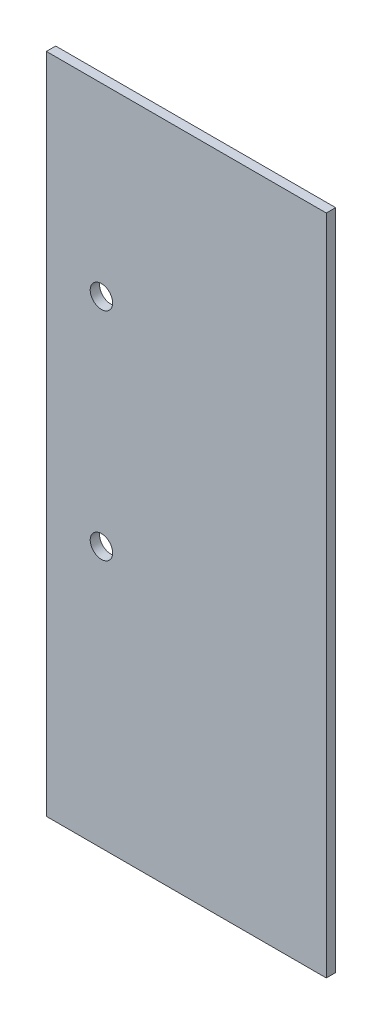
ISO-10303-21;
HEADER;
FILE_DESCRIPTION(('STEP AP214'),'2;1');
FILE_NAME('part.step','',(''),(''),'','','');
FILE_SCHEMA(('AUTOMOTIVE_DESIGN { 1 0 10303 214 1 1 1 1 }'));
ENDSEC;
DATA;
#1=APPLICATION_CONTEXT('core data for automotive mechanical design processes');
#2=APPLICATION_PROTOCOL_DEFINITION('international standard','automotive_design',2000,#1);
#3=PRODUCT_CONTEXT('',#1,'mechanical');
#4=PRODUCT('Part','Part','',(#3));
#5=PRODUCT_RELATED_PRODUCT_CATEGORY('part','',(#4));
#6=PRODUCT_DEFINITION_FORMATION('','',#4);
#7=PRODUCT_DEFINITION_CONTEXT('part definition',#1,'design');
#8=PRODUCT_DEFINITION('design','',#6,#7);
#9=PRODUCT_DEFINITION_SHAPE('','',#8);
#10=(LENGTH_UNIT() NAMED_UNIT(*) SI_UNIT(.MILLI.,.METRE.));
#11=(NAMED_UNIT(*) PLANE_ANGLE_UNIT() SI_UNIT($,.RADIAN.));
#12=(NAMED_UNIT(*) SI_UNIT($,.STERADIAN.) SOLID_ANGLE_UNIT());
#13=UNCERTAINTY_MEASURE_WITH_UNIT(LENGTH_MEASURE(1.E-05),#10,'distance_accuracy_value','');
#14=(GEOMETRIC_REPRESENTATION_CONTEXT(3) GLOBAL_UNCERTAINTY_ASSIGNED_CONTEXT((#13)) GLOBAL_UNIT_ASSIGNED_CONTEXT((#10,
#11,#12)) REPRESENTATION_CONTEXT('',''));
#15=CARTESIAN_POINT('',(0.,0.,0.));
#16=DIRECTION('',(0.,0.,1.));
#17=DIRECTION('',(1.,0.,0.));
#18=AXIS2_PLACEMENT_3D('',#15,#16,#17);
#19=CARTESIAN_POINT('',(75.,177.5,5.));
#20=DIRECTION('',(-1.,0.,0.));
#21=DIRECTION('',(0.,-1.,0.));
#22=AXIS2_PLACEMENT_3D('',#19,#20,#21);
#23=PLANE('',#22);
#24=DIRECTION('',(0.,1.,0.));
#25=VECTOR('',#24,1.);
#26=CARTESIAN_POINT('',(75.,177.5,0.));
#27=LINE('',#26,#25);
#28=CARTESIAN_POINT('',(75.0000000000001,-177.5,0.));
#29=VERTEX_POINT('',#28);
#30=CARTESIAN_POINT('',(75.,177.5,0.));
#31=VERTEX_POINT('',#30);
#32=EDGE_CURVE('E107',#29,#31,#27,.T.);
#33=ORIENTED_EDGE('',*,*,#32,.T.);
#34=DIRECTION('',(0.,0.,-1.));
#35=VECTOR('',#34,1.);
#36=CARTESIAN_POINT('',(75.,177.5,5.));
#37=LINE('',#36,#35);
#38=CARTESIAN_POINT('',(75.,177.5,5.));
#39=VERTEX_POINT('',#38);
#40=EDGE_CURVE('E11',#39,#31,#37,.T.);
#41=ORIENTED_EDGE('',*,*,#40,.F.);
#42=DIRECTION('',(0.,1.,0.));
#43=VECTOR('',#42,1.);
#44=CARTESIAN_POINT('',(75.,177.5,5.));
#45=LINE('',#44,#43);
#46=CARTESIAN_POINT('',(75.0000000000001,-177.5,5.));
#47=VERTEX_POINT('',#46);
#48=EDGE_CURVE('E94',#47,#39,#45,.T.);
#49=ORIENTED_EDGE('',*,*,#48,.F.);
#50=DIRECTION('',(0.,0.,-1.));
#51=VECTOR('',#50,1.);
#52=CARTESIAN_POINT('',(75.0000000000001,-177.5,5.));
#53=LINE('',#52,#51);
#54=EDGE_CURVE('E103',#47,#29,#53,.T.);
#55=ORIENTED_EDGE('',*,*,#54,.T.);
#56=EDGE_LOOP('',(#33,#41,#49,#55));
#57=FACE_BOUND('',#56,.T.);
#58=ADVANCED_FACE('F41',(#57),#23,.F.);
#59=CARTESIAN_POINT('',(-75.,177.5,5.));
#60=DIRECTION('',(0.,-1.,0.));
#61=DIRECTION('',(0.,0.,-1.));
#62=AXIS2_PLACEMENT_3D('',#59,#60,#61);
#63=PLANE('',#62);
#64=DIRECTION('',(-1.,0.,0.));
#65=VECTOR('',#64,1.);
#66=CARTESIAN_POINT('',(-75.,177.5,0.));
#67=LINE('',#66,#65);
#68=CARTESIAN_POINT('',(-75.,177.5,0.));
#69=VERTEX_POINT('',#68);
#70=EDGE_CURVE('E98',#31,#69,#67,.T.);
#71=ORIENTED_EDGE('',*,*,#70,.T.);
#72=DIRECTION('',(0.,0.,-1.));
#73=VECTOR('',#72,1.);
#74=CARTESIAN_POINT('',(-75.,177.5,5.));
#75=LINE('',#74,#73);
#76=CARTESIAN_POINT('',(-75.,177.5,5.));
#77=VERTEX_POINT('',#76);
#78=EDGE_CURVE('E50',#77,#69,#75,.T.);
#79=ORIENTED_EDGE('',*,*,#78,.F.);
#80=DIRECTION('',(-1.,0.,0.));
#81=VECTOR('',#80,1.);
#82=CARTESIAN_POINT('',(-75.,177.5,5.));
#83=LINE('',#82,#81);
#84=EDGE_CURVE('E89',#39,#77,#83,.T.);
#85=ORIENTED_EDGE('',*,*,#84,.F.);
#86=ORIENTED_EDGE('',*,*,#40,.T.);
#87=EDGE_LOOP('',(#71,#79,#85,#86));
#88=FACE_BOUND('',#87,.T.);
#89=ADVANCED_FACE('F97',(#88),#63,.F.);
#90=CARTESIAN_POINT('',(-75.,177.5,5.));
#91=DIRECTION('',(1.,0.,0.));
#92=DIRECTION('',(0.,1.,0.));
#93=AXIS2_PLACEMENT_3D('',#90,#91,#92);
#94=PLANE('',#93);
#95=DIRECTION('',(0.,-1.,0.));
#96=VECTOR('',#95,1.);
#97=CARTESIAN_POINT('',(-75.,177.5,0.));
#98=LINE('',#97,#96);
#99=CARTESIAN_POINT('',(-75.,-177.5,0.));
#100=VERTEX_POINT('',#99);
#101=EDGE_CURVE('E76',#69,#100,#98,.T.);
#102=ORIENTED_EDGE('',*,*,#101,.T.);
#103=DIRECTION('',(0.,0.,-1.));
#104=VECTOR('',#103,1.);
#105=CARTESIAN_POINT('',(-75.,-177.5,5.));
#106=LINE('',#105,#104);
#107=CARTESIAN_POINT('',(-75.,-177.5,5.));
#108=VERTEX_POINT('',#107);
#109=EDGE_CURVE('E99',#108,#100,#106,.T.);
#110=ORIENTED_EDGE('',*,*,#109,.F.);
#111=DIRECTION('',(0.,-1.,0.));
#112=VECTOR('',#111,1.);
#113=CARTESIAN_POINT('',(-75.,177.5,5.));
#114=LINE('',#113,#112);
#115=EDGE_CURVE('E92',#77,#108,#114,.T.);
#116=ORIENTED_EDGE('',*,*,#115,.F.);
#117=ORIENTED_EDGE('',*,*,#78,.T.);
#118=EDGE_LOOP('',(#102,#110,#116,#117));
#119=FACE_BOUND('',#118,.T.);
#120=ADVANCED_FACE('F101',(#119),#94,.F.);
#121=CARTESIAN_POINT('',(-75.,-177.5,5.));
#122=DIRECTION('',(0.,1.,0.));
#123=DIRECTION('',(0.,0.,1.));
#124=AXIS2_PLACEMENT_3D('',#121,#122,#123);
#125=PLANE('',#124);
#126=DIRECTION('',(1.,0.,0.));
#127=VECTOR('',#126,1.);
#128=CARTESIAN_POINT('',(-75.,-177.5,0.));
#129=LINE('',#128,#127);
#130=EDGE_CURVE('E82',#100,#29,#129,.T.);
#131=ORIENTED_EDGE('',*,*,#130,.T.);
#132=ORIENTED_EDGE('',*,*,#54,.F.);
#133=DIRECTION('',(1.,0.,0.));
#134=VECTOR('',#133,1.);
#135=CARTESIAN_POINT('',(-75.,-177.5,5.));
#136=LINE('',#135,#134);
#137=EDGE_CURVE('E59',#108,#47,#136,.T.);
#138=ORIENTED_EDGE('',*,*,#137,.F.);
#139=ORIENTED_EDGE('',*,*,#109,.T.);
#140=EDGE_LOOP('',(#131,#132,#138,#139));
#141=FACE_BOUND('',#140,.T.);
#142=ADVANCED_FACE('F200',(#141),#125,.F.);
#143=CARTESIAN_POINT('',(0.,0.,5.));
#144=DIRECTION('',(0.,0.,1.));
#145=DIRECTION('',(1.,0.,0.));
#146=AXIS2_PLACEMENT_3D('',#143,#144,#145);
#147=PLANE('',#146);
#148=CARTESIAN_POINT('',(-45.5,78.4999999999999,5.));
#149=DIRECTION('',(0.,0.,1.));
#150=DIRECTION('',(1.,0.,0.));
#151=AXIS2_PLACEMENT_3D('',#148,#149,#150);
#152=CIRCLE('',#151,6.);
#153=CARTESIAN_POINT('',(-39.5,78.4999999999999,5.));
#154=VERTEX_POINT('',#153);
#155=EDGE_CURVE('E116',#154,#154,#152,.T.);
#156=ORIENTED_EDGE('',*,*,#155,.F.);
#157=EDGE_LOOP('',(#156));
#158=FACE_BOUND('',#157,.T.);
#159=CARTESIAN_POINT('',(-45.5,-37.5000000000001,5.));
#160=DIRECTION('',(0.,0.,1.));
#161=DIRECTION('',(1.,0.,0.));
#162=AXIS2_PLACEMENT_3D('',#159,#160,#161);
#163=CIRCLE('',#162,5.99999999999999);
#164=CARTESIAN_POINT('',(-39.5,-37.5000000000001,5.));
#165=VERTEX_POINT('',#164);
#166=EDGE_CURVE('E121',#165,#165,#163,.T.);
#167=ORIENTED_EDGE('',*,*,#166,.F.);
#168=EDGE_LOOP('',(#167));
#169=FACE_BOUND('',#168,.T.);
#170=ORIENTED_EDGE('',*,*,#48,.T.);
#171=ORIENTED_EDGE('',*,*,#84,.T.);
#172=ORIENTED_EDGE('',*,*,#115,.T.);
#173=ORIENTED_EDGE('',*,*,#137,.T.);
#174=EDGE_LOOP('',(#170,#171,#172,#173));
#175=FACE_BOUND('',#174,.T.);
#176=ADVANCED_FACE('F90',(#158,#169,#175),#147,.T.);
#177=CARTESIAN_POINT('',(0.,0.,0.));
#178=DIRECTION('',(0.,0.,1.));
#179=DIRECTION('',(1.,0.,0.));
#180=AXIS2_PLACEMENT_3D('',#177,#178,#179);
#181=PLANE('',#180);
#182=CARTESIAN_POINT('',(-51.9062894408149,-122.4754829852,0.));
#183=DIRECTION('',(0.,0.,-1.));
#184=DIRECTION('',(-1.,0.,0.));
#185=AXIS2_PLACEMENT_3D('',#182,#183,#184);
#186=CIRCLE('',#185,1.49999999999999);
#187=CARTESIAN_POINT('',(-53.4062894408149,-122.4754829852,0.));
#188=VERTEX_POINT('',#187);
#189=EDGE_CURVE('E135',#188,#188,#186,.T.);
#190=ORIENTED_EDGE('',*,*,#189,.F.);
#191=EDGE_LOOP('',(#190));
#192=FACE_BOUND('',#191,.T.);
#193=CARTESIAN_POINT('',(-1.18869016070375,-113.50260182447,0.));
#194=DIRECTION('',(0.,0.,-1.));
#195=DIRECTION('',(-1.,0.,0.));
#196=AXIS2_PLACEMENT_3D('',#193,#194,#195);
#197=CIRCLE('',#196,1.5);
#198=CARTESIAN_POINT('',(-2.68869016070375,-113.50260182447,0.));
#199=VERTEX_POINT('',#198);
#200=EDGE_CURVE('E141',#199,#199,#197,.T.);
#201=ORIENTED_EDGE('',*,*,#200,.F.);
#202=EDGE_LOOP('',(#201));
#203=FACE_BOUND('',#202,.T.);
#204=CARTESIAN_POINT('',(-58.2462919447096,-86.530325199336,0.));
#205=DIRECTION('',(0.,0.,-1.));
#206=DIRECTION('',(-1.,0.,0.));
#207=AXIS2_PLACEMENT_3D('',#204,#205,#206);
#208=CIRCLE('',#207,1.5);
#209=CARTESIAN_POINT('',(-59.7462919447096,-86.530325199336,0.));
#210=VERTEX_POINT('',#209);
#211=EDGE_CURVE('E147',#210,#210,#208,.T.);
#212=ORIENTED_EDGE('',*,*,#211,.F.);
#213=EDGE_LOOP('',(#212));
#214=FACE_BOUND('',#213,.T.);
#215=CARTESIAN_POINT('',(-51.9062894408154,163.445482984937,0.));
#216=DIRECTION('',(0.,0.,-1.));
#217=DIRECTION('',(-1.,0.,0.));
#218=AXIS2_PLACEMENT_3D('',#215,#216,#217);
#219=CIRCLE('',#218,1.5);
#220=CARTESIAN_POINT('',(-53.4062894408154,163.445482984937,0.));
#221=VERTEX_POINT('',#220);
#222=EDGE_CURVE('E161',#221,#221,#219,.T.);
#223=ORIENTED_EDGE('',*,*,#222,.F.);
#224=EDGE_LOOP('',(#223));
#225=FACE_BOUND('',#224,.T.);
#226=CARTESIAN_POINT('',(-7.52915150711625,118.554842214162,0.));
#227=DIRECTION('',(0.,0.,-1.));
#228=DIRECTION('',(-1.,0.,0.));
#229=AXIS2_PLACEMENT_3D('',#226,#227,#228);
#230=CIRCLE('',#229,1.5);
#231=CARTESIAN_POINT('',(-9.02915150711625,118.554842214162,0.));
#232=VERTEX_POINT('',#231);
#233=EDGE_CURVE('E154',#232,#232,#230,.T.);
#234=ORIENTED_EDGE('',*,*,#233,.F.);
#235=EDGE_LOOP('',(#234));
#236=FACE_BOUND('',#235,.T.);
#237=CARTESIAN_POINT('',(-58.2462919447129,127.500325199059,0.));
#238=DIRECTION('',(0.,0.,-1.));
#239=DIRECTION('',(-1.,0.,0.));
#240=AXIS2_PLACEMENT_3D('',#237,#238,#239);
#241=CIRCLE('',#240,1.5);
#242=CARTESIAN_POINT('',(-59.7462919447129,127.500325199059,0.));
#243=VERTEX_POINT('',#242);
#244=EDGE_CURVE('E171',#243,#243,#241,.T.);
#245=ORIENTED_EDGE('',*,*,#244,.F.);
#246=EDGE_LOOP('',(#245));
#247=FACE_BOUND('',#246,.T.);
#248=CARTESIAN_POINT('',(-7.52915150712191,-77.5848422143889,0.));
#249=DIRECTION('',(0.,0.,-1.));
#250=DIRECTION('',(-1.,0.,0.));
#251=AXIS2_PLACEMENT_3D('',#248,#249,#250);
#252=CIRCLE('',#251,1.5);
#253=CARTESIAN_POINT('',(-9.02915150712191,-77.5848422143889,0.));
#254=VERTEX_POINT('',#253);
#255=EDGE_CURVE('E153',#254,#254,#252,.T.);
#256=ORIENTED_EDGE('',*,*,#255,.F.);
#257=EDGE_LOOP('',(#256));
#258=FACE_BOUND('',#257,.T.);
#259=CARTESIAN_POINT('',(-1.18869016069131,154.472601824215,0.));
#260=DIRECTION('',(0.,0.,-1.));
#261=DIRECTION('',(-1.,0.,0.));
#262=AXIS2_PLACEMENT_3D('',#259,#260,#261);
#263=CIRCLE('',#262,1.5);
#264=CARTESIAN_POINT('',(-2.68869016069131,154.472601824215,0.));
#265=VERTEX_POINT('',#264);
#266=EDGE_CURVE('E129',#265,#265,#263,.T.);
#267=ORIENTED_EDGE('',*,*,#266,.F.);
#268=EDGE_LOOP('',(#267));
#269=FACE_BOUND('',#268,.T.);
#270=CARTESIAN_POINT('',(-45.5,78.4999999999999,0.));
#271=DIRECTION('',(0.,0.,1.));
#272=DIRECTION('',(1.,0.,0.));
#273=AXIS2_PLACEMENT_3D('',#270,#271,#272);
#274=CIRCLE('',#273,6.);
#275=CARTESIAN_POINT('',(-39.5,78.4999999999999,0.));
#276=VERTEX_POINT('',#275);
#277=EDGE_CURVE('E44',#276,#276,#274,.T.);
#278=ORIENTED_EDGE('',*,*,#277,.T.);
#279=EDGE_LOOP('',(#278));
#280=FACE_BOUND('',#279,.T.);
#281=CARTESIAN_POINT('',(-45.5,-37.5000000000001,0.));
#282=DIRECTION('',(0.,0.,1.));
#283=DIRECTION('',(1.,0.,0.));
#284=AXIS2_PLACEMENT_3D('',#281,#282,#283);
#285=CIRCLE('',#284,5.99999999999999);
#286=CARTESIAN_POINT('',(-39.5,-37.5000000000001,0.));
#287=VERTEX_POINT('',#286);
#288=EDGE_CURVE('E114',#287,#287,#285,.T.);
#289=ORIENTED_EDGE('',*,*,#288,.T.);
#290=EDGE_LOOP('',(#289));
#291=FACE_BOUND('',#290,.T.);
#292=ORIENTED_EDGE('',*,*,#32,.F.);
#293=ORIENTED_EDGE('',*,*,#130,.F.);
#294=ORIENTED_EDGE('',*,*,#101,.F.);
#295=ORIENTED_EDGE('',*,*,#70,.F.);
#296=EDGE_LOOP('',(#292,#293,#294,#295));
#297=FACE_BOUND('',#296,.T.);
#298=ADVANCED_FACE('F186',(#192,#203,#214,#225,#236,#247,#258,#269,#280,#291,#297),#181,.F.);
#299=CARTESIAN_POINT('',(-45.5,-37.5000000000001,-15.));
#300=DIRECTION('',(0.,0.,1.));
#301=DIRECTION('',(1.,0.,0.));
#302=AXIS2_PLACEMENT_3D('',#299,#300,#301);
#303=CYLINDRICAL_SURFACE('',#302,5.99999999999999);
#304=ORIENTED_EDGE('',*,*,#166,.T.);
#305=EDGE_LOOP('',(#304));
#306=FACE_BOUND('',#305,.T.);
#307=ORIENTED_EDGE('',*,*,#288,.F.);
#308=EDGE_LOOP('',(#307));
#309=FACE_BOUND('',#308,.T.);
#310=ADVANCED_FACE('F189',(#306,#309),#303,.F.);
#311=CARTESIAN_POINT('',(-45.5,78.4999999999999,-15.));
#312=DIRECTION('',(0.,0.,1.));
#313=DIRECTION('',(1.,0.,0.));
#314=AXIS2_PLACEMENT_3D('',#311,#312,#313);
#315=CYLINDRICAL_SURFACE('',#314,6.);
#316=ORIENTED_EDGE('',*,*,#155,.T.);
#317=EDGE_LOOP('',(#316));
#318=FACE_BOUND('',#317,.T.);
#319=ORIENTED_EDGE('',*,*,#277,.F.);
#320=EDGE_LOOP('',(#319));
#321=FACE_BOUND('',#320,.T.);
#322=ADVANCED_FACE('F238',(#318,#321),#315,.F.);
#323=CARTESIAN_POINT('',(-1.18869016069131,154.472601824215,2.25));
#324=DIRECTION('',(0.,0.,-1.));
#325=DIRECTION('',(-1.,0.,0.));
#326=AXIS2_PLACEMENT_3D('',#323,#324,#325);
#327=CYLINDRICAL_SURFACE('',#326,1.5);
#328=CARTESIAN_POINT('',(-1.18869016069131,154.472601824215,2.25));
#329=DIRECTION('',(0.,0.,-1.));
#330=DIRECTION('',(-1.,0.,0.));
#331=AXIS2_PLACEMENT_3D('',#328,#329,#330);
#332=CIRCLE('',#331,1.5);
#333=CARTESIAN_POINT('',(-2.68869016069131,154.472601824215,2.25));
#334=VERTEX_POINT('',#333);
#335=EDGE_CURVE('E126',#334,#334,#332,.T.);
#336=ORIENTED_EDGE('',*,*,#335,.F.);
#337=EDGE_LOOP('',(#336));
#338=FACE_BOUND('',#337,.T.);
#339=ORIENTED_EDGE('',*,*,#266,.T.);
#340=EDGE_LOOP('',(#339));
#341=FACE_BOUND('',#340,.T.);
#342=ADVANCED_FACE('F248',(#338,#341),#327,.F.);
#343=CARTESIAN_POINT('',(-1.18869016069131,154.472601824215,2.25));
#344=DIRECTION('',(0.,0.,-1.));
#345=DIRECTION('',(-1.,0.,0.));
#346=AXIS2_PLACEMENT_3D('',#343,#344,#345);
#347=PLANE('',#346);
#348=ORIENTED_EDGE('',*,*,#335,.T.);
#349=EDGE_LOOP('',(#348));
#350=FACE_BOUND('',#349,.T.);
#351=ADVANCED_FACE('F260',(#350),#347,.T.);
#352=CARTESIAN_POINT('',(-7.52915150712191,-77.5848422143889,2.25));
#353=DIRECTION('',(0.,0.,-1.));
#354=DIRECTION('',(-1.,0.,0.));
#355=AXIS2_PLACEMENT_3D('',#352,#353,#354);
#356=CYLINDRICAL_SURFACE('',#355,1.5);
#357=CARTESIAN_POINT('',(-7.52915150712191,-77.5848422143889,2.25));
#358=DIRECTION('',(0.,0.,-1.));
#359=DIRECTION('',(-1.,0.,0.));
#360=AXIS2_PLACEMENT_3D('',#357,#358,#359);
#361=CIRCLE('',#360,1.5);
#362=CARTESIAN_POINT('',(-9.02915150712191,-77.5848422143889,2.25));
#363=VERTEX_POINT('',#362);
#364=EDGE_CURVE('E168',#363,#363,#361,.T.);
#365=ORIENTED_EDGE('',*,*,#364,.F.);
#366=EDGE_LOOP('',(#365));
#367=FACE_BOUND('',#366,.T.);
#368=ORIENTED_EDGE('',*,*,#255,.T.);
#369=EDGE_LOOP('',(#368));
#370=FACE_BOUND('',#369,.T.);
#371=ADVANCED_FACE('F270',(#367,#370),#356,.F.);
#372=CARTESIAN_POINT('',(-7.52915150712191,-77.5848422143889,2.25));
#373=DIRECTION('',(0.,0.,-1.));
#374=DIRECTION('',(-1.,0.,0.));
#375=AXIS2_PLACEMENT_3D('',#372,#373,#374);
#376=PLANE('',#375);
#377=ORIENTED_EDGE('',*,*,#364,.T.);
#378=EDGE_LOOP('',(#377));
#379=FACE_BOUND('',#378,.T.);
#380=ADVANCED_FACE('F182',(#379),#376,.T.);
#381=CARTESIAN_POINT('',(-58.2462919447129,127.500325199059,2.25));
#382=DIRECTION('',(0.,0.,-1.));
#383=DIRECTION('',(-1.,0.,0.));
#384=AXIS2_PLACEMENT_3D('',#381,#382,#383);
#385=CYLINDRICAL_SURFACE('',#384,1.5);
#386=CARTESIAN_POINT('',(-58.2462919447129,127.500325199059,2.25));
#387=DIRECTION('',(0.,0.,-1.));
#388=DIRECTION('',(-1.,0.,0.));
#389=AXIS2_PLACEMENT_3D('',#386,#387,#388);
#390=CIRCLE('',#389,1.5);
#391=CARTESIAN_POINT('',(-59.7462919447129,127.500325199059,2.25));
#392=VERTEX_POINT('',#391);
#393=EDGE_CURVE('E158',#392,#392,#390,.T.);
#394=ORIENTED_EDGE('',*,*,#393,.F.);
#395=EDGE_LOOP('',(#394));
#396=FACE_BOUND('',#395,.T.);
#397=ORIENTED_EDGE('',*,*,#244,.T.);
#398=EDGE_LOOP('',(#397));
#399=FACE_BOUND('',#398,.T.);
#400=ADVANCED_FACE('F179',(#396,#399),#385,.F.);
#401=CARTESIAN_POINT('',(-58.2462919447129,127.500325199059,2.25));
#402=DIRECTION('',(0.,0.,-1.));
#403=DIRECTION('',(-1.,0.,0.));
#404=AXIS2_PLACEMENT_3D('',#401,#402,#403);
#405=PLANE('',#404);
#406=ORIENTED_EDGE('',*,*,#393,.T.);
#407=EDGE_LOOP('',(#406));
#408=FACE_BOUND('',#407,.T.);
#409=ADVANCED_FACE('F177',(#408),#405,.T.);
#410=CARTESIAN_POINT('',(-7.52915150711625,118.554842214162,2.25));
#411=DIRECTION('',(0.,0.,-1.));
#412=DIRECTION('',(-1.,0.,0.));
#413=AXIS2_PLACEMENT_3D('',#410,#411,#412);
#414=CYLINDRICAL_SURFACE('',#413,1.5);
#415=CARTESIAN_POINT('',(-7.52915150711625,118.554842214162,2.25));
#416=DIRECTION('',(0.,0.,-1.));
#417=DIRECTION('',(-1.,0.,0.));
#418=AXIS2_PLACEMENT_3D('',#415,#416,#417);
#419=CIRCLE('',#418,1.5);
#420=CARTESIAN_POINT('',(-9.02915150711625,118.554842214162,2.25));
#421=VERTEX_POINT('',#420);
#422=EDGE_CURVE('E157',#421,#421,#419,.T.);
#423=ORIENTED_EDGE('',*,*,#422,.F.);
#424=EDGE_LOOP('',(#423));
#425=FACE_BOUND('',#424,.T.);
#426=ORIENTED_EDGE('',*,*,#233,.T.);
#427=EDGE_LOOP('',(#426));
#428=FACE_BOUND('',#427,.T.);
#429=ADVANCED_FACE('F304',(#425,#428),#414,.F.);
#430=CARTESIAN_POINT('',(-7.52915150711625,118.554842214162,2.25));
#431=DIRECTION('',(0.,0.,-1.));
#432=DIRECTION('',(-1.,0.,0.));
#433=AXIS2_PLACEMENT_3D('',#430,#431,#432);
#434=PLANE('',#433);
#435=ORIENTED_EDGE('',*,*,#422,.T.);
#436=EDGE_LOOP('',(#435));
#437=FACE_BOUND('',#436,.T.);
#438=ADVANCED_FACE('F313',(#437),#434,.T.);
#439=CARTESIAN_POINT('',(-51.9062894408154,163.445482984937,2.25));
#440=DIRECTION('',(0.,0.,-1.));
#441=DIRECTION('',(-1.,0.,0.));
#442=AXIS2_PLACEMENT_3D('',#439,#440,#441);
#443=CYLINDRICAL_SURFACE('',#442,1.5);
#444=CARTESIAN_POINT('',(-51.9062894408154,163.445482984937,2.25));
#445=DIRECTION('',(0.,0.,-1.));
#446=DIRECTION('',(-1.,0.,0.));
#447=AXIS2_PLACEMENT_3D('',#444,#445,#446);
#448=CIRCLE('',#447,1.5);
#449=CARTESIAN_POINT('',(-53.4062894408154,163.445482984937,2.25));
#450=VERTEX_POINT('',#449);
#451=EDGE_CURVE('E132',#450,#450,#448,.T.);
#452=ORIENTED_EDGE('',*,*,#451,.F.);
#453=EDGE_LOOP('',(#452));
#454=FACE_BOUND('',#453,.T.);
#455=ORIENTED_EDGE('',*,*,#222,.T.);
#456=EDGE_LOOP('',(#455));
#457=FACE_BOUND('',#456,.T.);
#458=ADVANCED_FACE('F323',(#454,#457),#443,.F.);
#459=CARTESIAN_POINT('',(-51.9062894408154,163.445482984937,2.25));
#460=DIRECTION('',(0.,0.,-1.));
#461=DIRECTION('',(-1.,0.,0.));
#462=AXIS2_PLACEMENT_3D('',#459,#460,#461);
#463=PLANE('',#462);
#464=ORIENTED_EDGE('',*,*,#451,.T.);
#465=EDGE_LOOP('',(#464));
#466=FACE_BOUND('',#465,.T.);
#467=ADVANCED_FACE('F333',(#466),#463,.T.);
#468=CARTESIAN_POINT('',(-58.2462919447096,-86.530325199336,2.25));
#469=DIRECTION('',(0.,0.,-1.));
#470=DIRECTION('',(-1.,0.,0.));
#471=AXIS2_PLACEMENT_3D('',#468,#469,#470);
#472=CYLINDRICAL_SURFACE('',#471,1.5);
#473=CARTESIAN_POINT('',(-58.2462919447096,-86.530325199336,2.25));
#474=DIRECTION('',(0.,0.,-1.));
#475=DIRECTION('',(-1.,0.,0.));
#476=AXIS2_PLACEMENT_3D('',#473,#474,#475);
#477=CIRCLE('',#476,1.5);
#478=CARTESIAN_POINT('',(-59.7462919447096,-86.530325199336,2.25));
#479=VERTEX_POINT('',#478);
#480=EDGE_CURVE('E150',#479,#479,#477,.T.);
#481=ORIENTED_EDGE('',*,*,#480,.F.);
#482=EDGE_LOOP('',(#481));
#483=FACE_BOUND('',#482,.T.);
#484=ORIENTED_EDGE('',*,*,#211,.T.);
#485=EDGE_LOOP('',(#484));
#486=FACE_BOUND('',#485,.T.);
#487=ADVANCED_FACE('F343',(#483,#486),#472,.F.);
#488=CARTESIAN_POINT('',(-58.2462919447096,-86.530325199336,2.25));
#489=DIRECTION('',(0.,0.,-1.));
#490=DIRECTION('',(-1.,0.,0.));
#491=AXIS2_PLACEMENT_3D('',#488,#489,#490);
#492=PLANE('',#491);
#493=ORIENTED_EDGE('',*,*,#480,.T.);
#494=EDGE_LOOP('',(#493));
#495=FACE_BOUND('',#494,.T.);
#496=ADVANCED_FACE('F353',(#495),#492,.T.);
#497=CARTESIAN_POINT('',(-1.18869016070375,-113.50260182447,2.25));
#498=DIRECTION('',(0.,0.,-1.));
#499=DIRECTION('',(-1.,0.,0.));
#500=AXIS2_PLACEMENT_3D('',#497,#498,#499);
#501=CYLINDRICAL_SURFACE('',#500,1.5);
#502=CARTESIAN_POINT('',(-1.18869016070375,-113.50260182447,2.25));
#503=DIRECTION('',(0.,0.,-1.));
#504=DIRECTION('',(-1.,0.,0.));
#505=AXIS2_PLACEMENT_3D('',#502,#503,#504);
#506=CIRCLE('',#505,1.5);
#507=CARTESIAN_POINT('',(-2.68869016070375,-113.50260182447,2.25));
#508=VERTEX_POINT('',#507);
#509=EDGE_CURVE('E144',#508,#508,#506,.T.);
#510=ORIENTED_EDGE('',*,*,#509,.F.);
#511=EDGE_LOOP('',(#510));
#512=FACE_BOUND('',#511,.T.);
#513=ORIENTED_EDGE('',*,*,#200,.T.);
#514=EDGE_LOOP('',(#513));
#515=FACE_BOUND('',#514,.T.);
#516=ADVANCED_FACE('F363',(#512,#515),#501,.F.);
#517=CARTESIAN_POINT('',(-1.18869016070375,-113.50260182447,2.25));
#518=DIRECTION('',(0.,0.,-1.));
#519=DIRECTION('',(-1.,0.,0.));
#520=AXIS2_PLACEMENT_3D('',#517,#518,#519);
#521=PLANE('',#520);
#522=ORIENTED_EDGE('',*,*,#509,.T.);
#523=EDGE_LOOP('',(#522));
#524=FACE_BOUND('',#523,.T.);
#525=ADVANCED_FACE('F373',(#524),#521,.T.);
#526=CARTESIAN_POINT('',(-51.9062894408149,-122.4754829852,2.25));
#527=DIRECTION('',(0.,0.,-1.));
#528=DIRECTION('',(-1.,0.,0.));
#529=AXIS2_PLACEMENT_3D('',#526,#527,#528);
#530=CYLINDRICAL_SURFACE('',#529,1.49999999999999);
#531=CARTESIAN_POINT('',(-51.9062894408149,-122.4754829852,2.25));
#532=DIRECTION('',(0.,0.,-1.));
#533=DIRECTION('',(-1.,0.,0.));
#534=AXIS2_PLACEMENT_3D('',#531,#532,#533);
#535=CIRCLE('',#534,1.49999999999999);
#536=CARTESIAN_POINT('',(-53.4062894408149,-122.4754829852,2.25));
#537=VERTEX_POINT('',#536);
#538=EDGE_CURVE('E138',#537,#537,#535,.T.);
#539=ORIENTED_EDGE('',*,*,#538,.F.);
#540=EDGE_LOOP('',(#539));
#541=FACE_BOUND('',#540,.T.);
#542=ORIENTED_EDGE('',*,*,#189,.T.);
#543=EDGE_LOOP('',(#542));
#544=FACE_BOUND('',#543,.T.);
#545=ADVANCED_FACE('F383',(#541,#544),#530,.F.);
#546=CARTESIAN_POINT('',(-51.9062894408149,-122.4754829852,2.25));
#547=DIRECTION('',(0.,0.,-1.));
#548=DIRECTION('',(-1.,0.,0.));
#549=AXIS2_PLACEMENT_3D('',#546,#547,#548);
#550=PLANE('',#549);
#551=ORIENTED_EDGE('',*,*,#538,.T.);
#552=EDGE_LOOP('',(#551));
#553=FACE_BOUND('',#552,.T.);
#554=ADVANCED_FACE('F393',(#553),#550,.T.);
#555=CLOSED_SHELL('',(#58,#89,#120,#142,#176,#298,#310,#322,#342,#351,#371,#380,#400,#409,#429,
#438,#458,#467,#487,#496,#516,#525,#545,#554));
#556=MANIFOLD_SOLID_BREP('B2',#555);
#557=ADVANCED_BREP_SHAPE_REPRESENTATION('',(#18,#556),#14);
#558=SHAPE_DEFINITION_REPRESENTATION(#9,#557);
ENDSEC;
END-ISO-10303-21;
